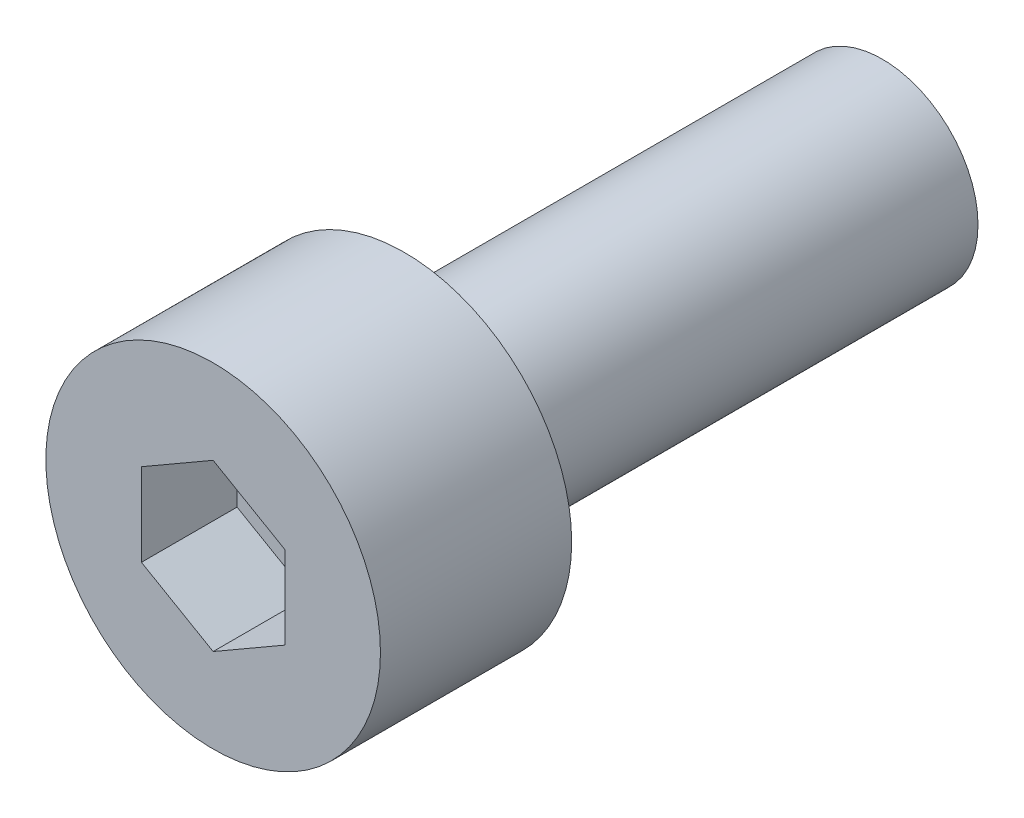
ISO-10303-21;
HEADER;
FILE_DESCRIPTION(('STEP AP214'),'2;1');
FILE_NAME('part.step','',(''),(''),'','','');
FILE_SCHEMA(('AUTOMOTIVE_DESIGN { 1 0 10303 214 1 1 1 1 }'));
ENDSEC;
DATA;
#1=APPLICATION_CONTEXT('core data for automotive mechanical design processes');
#2=APPLICATION_PROTOCOL_DEFINITION('international standard','automotive_design',2000,#1);
#3=PRODUCT_CONTEXT('',#1,'mechanical');
#4=PRODUCT('Part','Part','',(#3));
#5=PRODUCT_RELATED_PRODUCT_CATEGORY('part','',(#4));
#6=PRODUCT_DEFINITION_FORMATION('','',#4);
#7=PRODUCT_DEFINITION_CONTEXT('part definition',#1,'design');
#8=PRODUCT_DEFINITION('design','',#6,#7);
#9=PRODUCT_DEFINITION_SHAPE('','',#8);
#10=(LENGTH_UNIT() NAMED_UNIT(*) SI_UNIT(.MILLI.,.METRE.));
#11=(NAMED_UNIT(*) PLANE_ANGLE_UNIT() SI_UNIT($,.RADIAN.));
#12=(NAMED_UNIT(*) SI_UNIT($,.STERADIAN.) SOLID_ANGLE_UNIT());
#13=UNCERTAINTY_MEASURE_WITH_UNIT(LENGTH_MEASURE(1.E-05),#10,'distance_accuracy_value','');
#14=(GEOMETRIC_REPRESENTATION_CONTEXT(3) GLOBAL_UNCERTAINTY_ASSIGNED_CONTEXT((#13)) GLOBAL_UNIT_ASSIGNED_CONTEXT((#10,
#11,#12)) REPRESENTATION_CONTEXT('',''));
#15=CARTESIAN_POINT('',(0.,0.,0.));
#16=DIRECTION('',(0.,0.,1.));
#17=DIRECTION('',(1.,0.,0.));
#18=AXIS2_PLACEMENT_3D('',#15,#16,#17);
#19=CARTESIAN_POINT('',(0.,0.,4.));
#20=DIRECTION('',(0.,0.,-1.));
#21=DIRECTION('',(-1.,0.,0.));
#22=AXIS2_PLACEMENT_3D('',#19,#20,#21);
#23=CYLINDRICAL_SURFACE('',#22,3.5);
#24=CARTESIAN_POINT('',(0.,0.,4.));
#25=DIRECTION('',(0.,0.,1.));
#26=DIRECTION('',(1.,0.,0.));
#27=AXIS2_PLACEMENT_3D('',#24,#25,#26);
#28=CIRCLE('',#27,3.5);
#29=CARTESIAN_POINT('',(3.5,0.,4.));
#30=VERTEX_POINT('',#29);
#31=EDGE_CURVE('E42',#30,#30,#28,.T.);
#32=ORIENTED_EDGE('',*,*,#31,.F.);
#33=EDGE_LOOP('',(#32));
#34=FACE_BOUND('',#33,.T.);
#35=CARTESIAN_POINT('',(0.,0.,0.));
#36=DIRECTION('',(0.,0.,1.));
#37=DIRECTION('',(1.,0.,0.));
#38=AXIS2_PLACEMENT_3D('',#35,#36,#37);
#39=CIRCLE('',#38,3.5);
#40=CARTESIAN_POINT('',(3.5,0.,0.));
#41=VERTEX_POINT('',#40);
#42=EDGE_CURVE('E37',#41,#41,#39,.T.);
#43=ORIENTED_EDGE('',*,*,#42,.T.);
#44=EDGE_LOOP('',(#43));
#45=FACE_BOUND('',#44,.T.);
#46=ADVANCED_FACE('F34',(#34,#45),#23,.T.);
#47=CARTESIAN_POINT('',(0.,0.,4.));
#48=DIRECTION('',(0.,0.,1.));
#49=DIRECTION('',(1.,0.,0.));
#50=AXIS2_PLACEMENT_3D('',#47,#48,#49);
#51=PLANE('',#50);
#52=DIRECTION('',(0.,1.,0.));
#53=VECTOR('',#52,1.);
#54=CARTESIAN_POINT('',(1.5,-0.866025403784438,4.));
#55=LINE('',#54,#53);
#56=CARTESIAN_POINT('',(1.5,-0.866025403784438,4.));
#57=VERTEX_POINT('',#56);
#58=CARTESIAN_POINT('',(1.5,0.866025403784439,4.));
#59=VERTEX_POINT('',#58);
#60=EDGE_CURVE('E50',#57,#59,#55,.T.);
#61=ORIENTED_EDGE('',*,*,#60,.F.);
#62=DIRECTION('',(0.866025403784439,0.5,0.));
#63=VECTOR('',#62,1.);
#64=CARTESIAN_POINT('',(0.,-1.73205080756888,4.));
#65=LINE('',#64,#63);
#66=CARTESIAN_POINT('',(0.,-1.73205080756888,4.));
#67=VERTEX_POINT('',#66);
#68=EDGE_CURVE('E134',#67,#57,#65,.T.);
#69=ORIENTED_EDGE('',*,*,#68,.F.);
#70=DIRECTION('',(0.866025403784439,-0.5,0.));
#71=VECTOR('',#70,1.);
#72=CARTESIAN_POINT('',(-1.5,-0.866025403784439,4.));
#73=LINE('',#72,#71);
#74=CARTESIAN_POINT('',(-1.5,-0.866025403784439,4.));
#75=VERTEX_POINT('',#74);
#76=EDGE_CURVE('E132',#75,#67,#73,.T.);
#77=ORIENTED_EDGE('',*,*,#76,.F.);
#78=DIRECTION('',(0.,-1.,0.));
#79=VECTOR('',#78,1.);
#80=CARTESIAN_POINT('',(-1.5,0.866025403784438,4.));
#81=LINE('',#80,#79);
#82=CARTESIAN_POINT('',(-1.5,0.866025403784438,4.));
#83=VERTEX_POINT('',#82);
#84=EDGE_CURVE('E98',#83,#75,#81,.T.);
#85=ORIENTED_EDGE('',*,*,#84,.F.);
#86=DIRECTION('',(-0.866025403784438,-0.5,0.));
#87=VECTOR('',#86,1.);
#88=CARTESIAN_POINT('',(0.,1.73205080756888,4.));
#89=LINE('',#88,#87);
#90=CARTESIAN_POINT('',(0.,1.73205080756888,4.));
#91=VERTEX_POINT('',#90);
#92=EDGE_CURVE('E128',#91,#83,#89,.T.);
#93=ORIENTED_EDGE('',*,*,#92,.F.);
#94=DIRECTION('',(-0.866025403784439,0.5,0.));
#95=VECTOR('',#94,1.);
#96=CARTESIAN_POINT('',(1.5,0.866025403784438,4.));
#97=LINE('',#96,#95);
#98=EDGE_CURVE('E124',#59,#91,#97,.T.);
#99=ORIENTED_EDGE('',*,*,#98,.F.);
#100=EDGE_LOOP('',(#61,#69,#77,#85,#93,#99));
#101=FACE_BOUND('',#100,.T.);
#102=ORIENTED_EDGE('',*,*,#31,.T.);
#103=EDGE_LOOP('',(#102));
#104=FACE_BOUND('',#103,.T.);
#105=ADVANCED_FACE('F152',(#101,#104),#51,.T.);
#106=CARTESIAN_POINT('',(0.,0.,0.));
#107=DIRECTION('',(0.,0.,1.));
#108=DIRECTION('',(1.,0.,0.));
#109=AXIS2_PLACEMENT_3D('',#106,#107,#108);
#110=PLANE('',#109);
#111=CARTESIAN_POINT('',(0.,0.,0.));
#112=DIRECTION('',(0.,0.,-1.));
#113=DIRECTION('',(-1.,0.,0.));
#114=AXIS2_PLACEMENT_3D('',#111,#112,#113);
#115=CIRCLE('',#114,2.);
#116=CARTESIAN_POINT('',(-2.,0.,0.));
#117=VERTEX_POINT('',#116);
#118=EDGE_CURVE('E11',#117,#117,#115,.T.);
#119=ORIENTED_EDGE('',*,*,#118,.F.);
#120=EDGE_LOOP('',(#119));
#121=FACE_BOUND('',#120,.T.);
#122=ORIENTED_EDGE('',*,*,#42,.F.);
#123=EDGE_LOOP('',(#122));
#124=FACE_BOUND('',#123,.T.);
#125=ADVANCED_FACE('F149',(#121,#124),#110,.F.);
#126=CARTESIAN_POINT('',(1.5,-0.866025403784438,2.));
#127=DIRECTION('',(1.,0.,0.));
#128=DIRECTION('',(0.,0.,-1.));
#129=AXIS2_PLACEMENT_3D('',#126,#127,#128);
#130=PLANE('',#129);
#131=ORIENTED_EDGE('',*,*,#60,.T.);
#132=DIRECTION('',(0.,0.,1.));
#133=VECTOR('',#132,1.);
#134=CARTESIAN_POINT('',(1.5,0.866025403784438,2.));
#135=LINE('',#134,#133);
#136=CARTESIAN_POINT('',(1.5,0.866025403784438,2.));
#137=VERTEX_POINT('',#136);
#138=EDGE_CURVE('E80',#137,#59,#135,.T.);
#139=ORIENTED_EDGE('',*,*,#138,.F.);
#140=DIRECTION('',(0.,1.,0.));
#141=VECTOR('',#140,1.);
#142=CARTESIAN_POINT('',(1.5,-0.866025403784438,2.));
#143=LINE('',#142,#141);
#144=CARTESIAN_POINT('',(1.5,-0.866025403784438,2.));
#145=VERTEX_POINT('',#144);
#146=EDGE_CURVE('E136',#145,#137,#143,.T.);
#147=ORIENTED_EDGE('',*,*,#146,.F.);
#148=DIRECTION('',(0.,0.,1.));
#149=VECTOR('',#148,1.);
#150=CARTESIAN_POINT('',(1.5,-0.866025403784438,2.));
#151=LINE('',#150,#149);
#152=EDGE_CURVE('E58',#145,#57,#151,.T.);
#153=ORIENTED_EDGE('',*,*,#152,.T.);
#154=EDGE_LOOP('',(#131,#139,#147,#153));
#155=FACE_BOUND('',#154,.T.);
#156=ADVANCED_FACE('F151',(#155),#130,.F.);
#157=CARTESIAN_POINT('',(0.,-1.73205080756888,2.));
#158=DIRECTION('',(0.5,-0.866025403784439,0.));
#159=DIRECTION('',(0.866025403784439,0.5,0.));
#160=AXIS2_PLACEMENT_3D('',#157,#158,#159);
#161=PLANE('',#160);
#162=ORIENTED_EDGE('',*,*,#68,.T.);
#163=ORIENTED_EDGE('',*,*,#152,.F.);
#164=DIRECTION('',(0.866025403784439,0.5,0.));
#165=VECTOR('',#164,1.);
#166=CARTESIAN_POINT('',(0.,-1.73205080756888,2.));
#167=LINE('',#166,#165);
#168=CARTESIAN_POINT('',(0.,-1.73205080756888,2.));
#169=VERTEX_POINT('',#168);
#170=EDGE_CURVE('E110',#169,#145,#167,.T.);
#171=ORIENTED_EDGE('',*,*,#170,.F.);
#172=DIRECTION('',(0.,0.,1.));
#173=VECTOR('',#172,1.);
#174=CARTESIAN_POINT('',(0.,-1.73205080756888,2.));
#175=LINE('',#174,#173);
#176=EDGE_CURVE('E102',#169,#67,#175,.T.);
#177=ORIENTED_EDGE('',*,*,#176,.T.);
#178=EDGE_LOOP('',(#162,#163,#171,#177));
#179=FACE_BOUND('',#178,.T.);
#180=ADVANCED_FACE('F158',(#179),#161,.F.);
#181=CARTESIAN_POINT('',(-1.5,-0.866025403784439,2.));
#182=DIRECTION('',(-0.5,-0.866025403784439,0.));
#183=DIRECTION('',(0.866025403784439,-0.5,0.));
#184=AXIS2_PLACEMENT_3D('',#181,#182,#183);
#185=PLANE('',#184);
#186=ORIENTED_EDGE('',*,*,#76,.T.);
#187=ORIENTED_EDGE('',*,*,#176,.F.);
#188=DIRECTION('',(0.866025403784439,-0.5,0.));
#189=VECTOR('',#188,1.);
#190=CARTESIAN_POINT('',(-1.5,-0.866025403784439,2.));
#191=LINE('',#190,#189);
#192=CARTESIAN_POINT('',(-1.5,-0.866025403784439,2.));
#193=VERTEX_POINT('',#192);
#194=EDGE_CURVE('E106',#193,#169,#191,.T.);
#195=ORIENTED_EDGE('',*,*,#194,.F.);
#196=DIRECTION('',(0.,0.,1.));
#197=VECTOR('',#196,1.);
#198=CARTESIAN_POINT('',(-1.5,-0.866025403784439,2.));
#199=LINE('',#198,#197);
#200=EDGE_CURVE('E91',#193,#75,#199,.T.);
#201=ORIENTED_EDGE('',*,*,#200,.T.);
#202=EDGE_LOOP('',(#186,#187,#195,#201));
#203=FACE_BOUND('',#202,.T.);
#204=ADVANCED_FACE('F107',(#203),#185,.F.);
#205=CARTESIAN_POINT('',(-1.5,0.866025403784438,2.));
#206=DIRECTION('',(-1.,0.,0.));
#207=DIRECTION('',(0.,0.,1.));
#208=AXIS2_PLACEMENT_3D('',#205,#206,#207);
#209=PLANE('',#208);
#210=ORIENTED_EDGE('',*,*,#84,.T.);
#211=ORIENTED_EDGE('',*,*,#200,.F.);
#212=DIRECTION('',(0.,-1.,0.));
#213=VECTOR('',#212,1.);
#214=CARTESIAN_POINT('',(-1.5,0.866025403784438,2.));
#215=LINE('',#214,#213);
#216=CARTESIAN_POINT('',(-1.5,0.866025403784438,2.));
#217=VERTEX_POINT('',#216);
#218=EDGE_CURVE('E95',#217,#193,#215,.T.);
#219=ORIENTED_EDGE('',*,*,#218,.F.);
#220=DIRECTION('',(0.,0.,1.));
#221=VECTOR('',#220,1.);
#222=CARTESIAN_POINT('',(-1.5,0.866025403784438,2.));
#223=LINE('',#222,#221);
#224=EDGE_CURVE('E103',#217,#83,#223,.T.);
#225=ORIENTED_EDGE('',*,*,#224,.T.);
#226=EDGE_LOOP('',(#210,#211,#219,#225));
#227=FACE_BOUND('',#226,.T.);
#228=ADVANCED_FACE('F93',(#227),#209,.F.);
#229=CARTESIAN_POINT('',(0.,1.73205080756888,2.));
#230=DIRECTION('',(-0.5,0.866025403784438,0.));
#231=DIRECTION('',(-0.866025403784439,-0.5,0.));
#232=AXIS2_PLACEMENT_3D('',#229,#230,#231);
#233=PLANE('',#232);
#234=ORIENTED_EDGE('',*,*,#92,.T.);
#235=ORIENTED_EDGE('',*,*,#224,.F.);
#236=DIRECTION('',(-0.866025403784438,-0.5,0.));
#237=VECTOR('',#236,1.);
#238=CARTESIAN_POINT('',(0.,1.73205080756888,2.));
#239=LINE('',#238,#237);
#240=CARTESIAN_POINT('',(0.,1.73205080756888,2.));
#241=VERTEX_POINT('',#240);
#242=EDGE_CURVE('E116',#241,#217,#239,.T.);
#243=ORIENTED_EDGE('',*,*,#242,.F.);
#244=DIRECTION('',(0.,0.,1.));
#245=VECTOR('',#244,1.);
#246=CARTESIAN_POINT('',(0.,1.73205080756888,2.));
#247=LINE('',#246,#245);
#248=EDGE_CURVE('E140',#241,#91,#247,.T.);
#249=ORIENTED_EDGE('',*,*,#248,.T.);
#250=EDGE_LOOP('',(#234,#235,#243,#249));
#251=FACE_BOUND('',#250,.T.);
#252=ADVANCED_FACE('F203',(#251),#233,.F.);
#253=CARTESIAN_POINT('',(1.5,0.866025403784438,2.));
#254=DIRECTION('',(0.5,0.866025403784439,0.));
#255=DIRECTION('',(-0.866025403784439,0.5,0.));
#256=AXIS2_PLACEMENT_3D('',#253,#254,#255);
#257=PLANE('',#256);
#258=ORIENTED_EDGE('',*,*,#98,.T.);
#259=ORIENTED_EDGE('',*,*,#248,.F.);
#260=DIRECTION('',(-0.866025403784439,0.5,0.));
#261=VECTOR('',#260,1.);
#262=CARTESIAN_POINT('',(1.5,0.866025403784438,2.));
#263=LINE('',#262,#261);
#264=EDGE_CURVE('E118',#137,#241,#263,.T.);
#265=ORIENTED_EDGE('',*,*,#264,.F.);
#266=ORIENTED_EDGE('',*,*,#138,.T.);
#267=EDGE_LOOP('',(#258,#259,#265,#266));
#268=FACE_BOUND('',#267,.T.);
#269=ADVANCED_FACE('F212',(#268),#257,.F.);
#270=CARTESIAN_POINT('',(0.,0.,2.));
#271=DIRECTION('',(0.,0.,1.));
#272=DIRECTION('',(1.,0.,0.));
#273=AXIS2_PLACEMENT_3D('',#270,#271,#272);
#274=PLANE('',#273);
#275=ORIENTED_EDGE('',*,*,#146,.T.);
#276=ORIENTED_EDGE('',*,*,#264,.T.);
#277=ORIENTED_EDGE('',*,*,#242,.T.);
#278=ORIENTED_EDGE('',*,*,#218,.T.);
#279=ORIENTED_EDGE('',*,*,#194,.T.);
#280=ORIENTED_EDGE('',*,*,#170,.T.);
#281=EDGE_LOOP('',(#275,#276,#277,#278,#279,#280));
#282=FACE_BOUND('',#281,.T.);
#283=ADVANCED_FACE('F113',(#282),#274,.T.);
#284=CARTESIAN_POINT('',(0.,0.,-10.));
#285=DIRECTION('',(0.,0.,1.));
#286=DIRECTION('',(1.,0.,0.));
#287=AXIS2_PLACEMENT_3D('',#284,#285,#286);
#288=CYLINDRICAL_SURFACE('',#287,2.);
#289=CARTESIAN_POINT('',(0.,0.,-10.));
#290=DIRECTION('',(0.,0.,-1.));
#291=DIRECTION('',(-1.,0.,0.));
#292=AXIS2_PLACEMENT_3D('',#289,#290,#291);
#293=CIRCLE('',#292,2.);
#294=CARTESIAN_POINT('',(-2.,0.,-10.));
#295=VERTEX_POINT('',#294);
#296=EDGE_CURVE('E125',#295,#295,#293,.T.);
#297=ORIENTED_EDGE('',*,*,#296,.F.);
#298=EDGE_LOOP('',(#297));
#299=FACE_BOUND('',#298,.T.);
#300=ORIENTED_EDGE('',*,*,#118,.T.);
#301=EDGE_LOOP('',(#300));
#302=FACE_BOUND('',#301,.T.);
#303=ADVANCED_FACE('F230',(#299,#302),#288,.T.);
#304=CARTESIAN_POINT('',(0.,0.,-10.));
#305=DIRECTION('',(0.,0.,-1.));
#306=DIRECTION('',(-1.,0.,0.));
#307=AXIS2_PLACEMENT_3D('',#304,#305,#306);
#308=PLANE('',#307);
#309=ORIENTED_EDGE('',*,*,#296,.T.);
#310=EDGE_LOOP('',(#309));
#311=FACE_BOUND('',#310,.T.);
#312=ADVANCED_FACE('F243',(#311),#308,.T.);
#313=CLOSED_SHELL('',(#46,#105,#125,#156,#180,#204,#228,#252,#269,#283,#303,#312));
#314=MANIFOLD_SOLID_BREP('B2',#313);
#315=ADVANCED_BREP_SHAPE_REPRESENTATION('',(#18,#314),#14);
#316=SHAPE_DEFINITION_REPRESENTATION(#9,#315);
ENDSEC;
END-ISO-10303-21;
